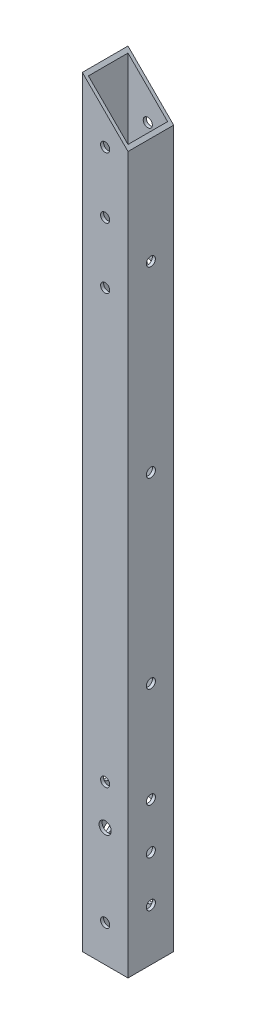
ISO-10303-21;
HEADER;
FILE_DESCRIPTION(('STEP AP214'),'2;1');
FILE_NAME('part.step','',(''),(''),'','','');
FILE_SCHEMA(('AUTOMOTIVE_DESIGN { 1 0 10303 214 1 1 1 1 }'));
ENDSEC;
DATA;
#1=APPLICATION_CONTEXT('core data for automotive mechanical design processes');
#2=APPLICATION_PROTOCOL_DEFINITION('international standard','automotive_design',2000,#1);
#3=PRODUCT_CONTEXT('',#1,'mechanical');
#4=PRODUCT('Part','Part','',(#3));
#5=PRODUCT_RELATED_PRODUCT_CATEGORY('part','',(#4));
#6=PRODUCT_DEFINITION_FORMATION('','',#4);
#7=PRODUCT_DEFINITION_CONTEXT('part definition',#1,'design');
#8=PRODUCT_DEFINITION('design','',#6,#7);
#9=PRODUCT_DEFINITION_SHAPE('','',#8);
#10=(LENGTH_UNIT() NAMED_UNIT(*) SI_UNIT(.MILLI.,.METRE.));
#11=(NAMED_UNIT(*) PLANE_ANGLE_UNIT() SI_UNIT($,.RADIAN.));
#12=(NAMED_UNIT(*) SI_UNIT($,.STERADIAN.) SOLID_ANGLE_UNIT());
#13=UNCERTAINTY_MEASURE_WITH_UNIT(LENGTH_MEASURE(1.E-05),#10,'distance_accuracy_value','');
#14=(GEOMETRIC_REPRESENTATION_CONTEXT(3) GLOBAL_UNCERTAINTY_ASSIGNED_CONTEXT((#13)) GLOBAL_UNIT_ASSIGNED_CONTEXT((#10,
#11,#12)) REPRESENTATION_CONTEXT('',''));
#15=CARTESIAN_POINT('',(0.,0.,0.));
#16=DIRECTION('',(0.,0.,1.));
#17=DIRECTION('',(1.,0.,0.));
#18=AXIS2_PLACEMENT_3D('',#15,#16,#17);
#19=CARTESIAN_POINT('',(0.,0.,0.));
#20=DIRECTION('',(0.,-1.,0.));
#21=DIRECTION('',(0.,0.,-1.));
#22=AXIS2_PLACEMENT_3D('',#19,#20,#21);
#23=PLANE('',#22);
#24=DIRECTION('',(0.,0.,-1.));
#25=VECTOR('',#24,1.);
#26=CARTESIAN_POINT('',(7.5,0.,7.5));
#27=LINE('',#26,#25);
#28=CARTESIAN_POINT('',(7.5,0.,7.5));
#29=VERTEX_POINT('',#28);
#30=CARTESIAN_POINT('',(7.5,0.,-7.5));
#31=VERTEX_POINT('',#30);
#32=EDGE_CURVE('E136',#29,#31,#27,.T.);
#33=ORIENTED_EDGE('',*,*,#32,.F.);
#34=DIRECTION('',(1.,0.,0.));
#35=VECTOR('',#34,1.);
#36=CARTESIAN_POINT('',(-7.5,0.,7.5));
#37=LINE('',#36,#35);
#38=CARTESIAN_POINT('',(-7.5,0.,7.5));
#39=VERTEX_POINT('',#38);
#40=EDGE_CURVE('E126',#39,#29,#37,.T.);
#41=ORIENTED_EDGE('',*,*,#40,.F.);
#42=DIRECTION('',(0.,0.,1.));
#43=VECTOR('',#42,1.);
#44=CARTESIAN_POINT('',(-7.5,0.,7.5));
#45=LINE('',#44,#43);
#46=CARTESIAN_POINT('',(-7.5,0.,-7.5));
#47=VERTEX_POINT('',#46);
#48=EDGE_CURVE('E130',#47,#39,#45,.T.);
#49=ORIENTED_EDGE('',*,*,#48,.F.);
#50=DIRECTION('',(-1.,0.,0.));
#51=VECTOR('',#50,1.);
#52=CARTESIAN_POINT('',(-7.5,0.,-7.5));
#53=LINE('',#52,#51);
#54=EDGE_CURVE('E117',#31,#47,#53,.T.);
#55=ORIENTED_EDGE('',*,*,#54,.F.);
#56=EDGE_LOOP('',(#33,#41,#49,#55));
#57=FACE_BOUND('',#56,.T.);
#58=DIRECTION('',(-1.,0.,0.));
#59=VECTOR('',#58,1.);
#60=CARTESIAN_POINT('',(-6.5,0.,-6.5));
#61=LINE('',#60,#59);
#62=CARTESIAN_POINT('',(6.5,0.,-6.5));
#63=VERTEX_POINT('',#62);
#64=CARTESIAN_POINT('',(-6.5,0.,-6.5));
#65=VERTEX_POINT('',#64);
#66=EDGE_CURVE('E272',#63,#65,#61,.T.);
#67=ORIENTED_EDGE('',*,*,#66,.T.);
#68=DIRECTION('',(0.,0.,1.));
#69=VECTOR('',#68,1.);
#70=CARTESIAN_POINT('',(-6.5,0.,6.5));
#71=LINE('',#70,#69);
#72=CARTESIAN_POINT('',(-6.5,0.,6.5));
#73=VERTEX_POINT('',#72);
#74=EDGE_CURVE('E263',#65,#73,#71,.T.);
#75=ORIENTED_EDGE('',*,*,#74,.T.);
#76=DIRECTION('',(1.,0.,0.));
#77=VECTOR('',#76,1.);
#78=CARTESIAN_POINT('',(-6.5,0.,6.5));
#79=LINE('',#78,#77);
#80=CARTESIAN_POINT('',(6.5,0.,6.5));
#81=VERTEX_POINT('',#80);
#82=EDGE_CURVE('E266',#73,#81,#79,.T.);
#83=ORIENTED_EDGE('',*,*,#82,.T.);
#84=DIRECTION('',(0.,0.,-1.));
#85=VECTOR('',#84,1.);
#86=CARTESIAN_POINT('',(6.5,0.,6.5));
#87=LINE('',#86,#85);
#88=EDGE_CURVE('E269',#81,#63,#87,.T.);
#89=ORIENTED_EDGE('',*,*,#88,.T.);
#90=EDGE_LOOP('',(#67,#75,#83,#89));
#91=FACE_BOUND('',#90,.T.);
#92=ADVANCED_FACE('F35',(#57,#91),#23,.T.);
#93=CARTESIAN_POINT('',(7.5,250.,7.5));
#94=DIRECTION('',(-1.,0.,0.));
#95=DIRECTION('',(0.,0.,1.));
#96=AXIS2_PLACEMENT_3D('',#93,#94,#95);
#97=PLANE('',#96);
#98=CARTESIAN_POINT('',(7.5,32.,0.));
#99=DIRECTION('',(1.,0.,0.));
#100=DIRECTION('',(0.,0.,-1.));
#101=AXIS2_PLACEMENT_3D('',#98,#99,#100);
#102=CIRCLE('',#101,1.5);
#103=CARTESIAN_POINT('',(7.5,32.,-1.5));
#104=VERTEX_POINT('',#103);
#105=EDGE_CURVE('E618',#104,#104,#102,.T.);
#106=ORIENTED_EDGE('',*,*,#105,.F.);
#107=EDGE_LOOP('',(#106));
#108=FACE_BOUND('',#107,.T.);
#109=CARTESIAN_POINT('',(7.5,47.,0.));
#110=DIRECTION('',(1.,0.,0.));
#111=DIRECTION('',(0.,0.,-1.));
#112=AXIS2_PLACEMENT_3D('',#109,#110,#111);
#113=CIRCLE('',#112,1.5);
#114=CARTESIAN_POINT('',(7.5,47.,-1.5));
#115=VERTEX_POINT('',#114);
#116=EDGE_CURVE('E626',#115,#115,#113,.T.);
#117=ORIENTED_EDGE('',*,*,#116,.F.);
#118=EDGE_LOOP('',(#117));
#119=FACE_BOUND('',#118,.T.);
#120=CARTESIAN_POINT('',(7.5,80.,0.));
#121=DIRECTION('',(1.,0.,0.));
#122=DIRECTION('',(0.,0.,-1.));
#123=AXIS2_PLACEMENT_3D('',#120,#121,#122);
#124=CIRCLE('',#123,1.5);
#125=CARTESIAN_POINT('',(7.5,80.,-1.5));
#126=VERTEX_POINT('',#125);
#127=EDGE_CURVE('E632',#126,#126,#124,.T.);
#128=ORIENTED_EDGE('',*,*,#127,.F.);
#129=EDGE_LOOP('',(#128));
#130=FACE_BOUND('',#129,.T.);
#131=CARTESIAN_POINT('',(7.5,140.,0.));
#132=DIRECTION('',(1.,0.,0.));
#133=DIRECTION('',(0.,0.,-1.));
#134=AXIS2_PLACEMENT_3D('',#131,#132,#133);
#135=CIRCLE('',#134,1.5);
#136=CARTESIAN_POINT('',(7.5,140.,-1.5));
#137=VERTEX_POINT('',#136);
#138=EDGE_CURVE('E638',#137,#137,#135,.T.);
#139=ORIENTED_EDGE('',*,*,#138,.F.);
#140=EDGE_LOOP('',(#139));
#141=FACE_BOUND('',#140,.T.);
#142=CARTESIAN_POINT('',(7.5,200.,0.));
#143=DIRECTION('',(1.,0.,0.));
#144=DIRECTION('',(0.,0.,-1.));
#145=AXIS2_PLACEMENT_3D('',#142,#143,#144);
#146=CIRCLE('',#145,1.5);
#147=CARTESIAN_POINT('',(7.5,200.,-1.5));
#148=VERTEX_POINT('',#147);
#149=EDGE_CURVE('E644',#148,#148,#146,.T.);
#150=ORIENTED_EDGE('',*,*,#149,.F.);
#151=EDGE_LOOP('',(#150));
#152=FACE_BOUND('',#151,.T.);
#153=CARTESIAN_POINT('',(7.5,17.,0.));
#154=DIRECTION('',(1.,0.,0.));
#155=DIRECTION('',(0.,0.,-1.));
#156=AXIS2_PLACEMENT_3D('',#153,#154,#155);
#157=CIRCLE('',#156,1.5);
#158=CARTESIAN_POINT('',(7.5,17.,-1.5));
#159=VERTEX_POINT('',#158);
#160=EDGE_CURVE('E203',#159,#159,#157,.T.);
#161=ORIENTED_EDGE('',*,*,#160,.F.);
#162=EDGE_LOOP('',(#161));
#163=FACE_BOUND('',#162,.T.);
#164=DIRECTION('',(0.,-1.,0.));
#165=VECTOR('',#164,1.);
#166=CARTESIAN_POINT('',(7.5,250.,-7.5));
#167=LINE('',#166,#165);
#168=CARTESIAN_POINT('',(7.5,235.,-7.5));
#169=VERTEX_POINT('',#168);
#170=EDGE_CURVE('E44',#169,#31,#167,.T.);
#171=ORIENTED_EDGE('',*,*,#170,.F.);
#172=DIRECTION('',(0.,0.,1.));
#173=VECTOR('',#172,1.);
#174=CARTESIAN_POINT('',(7.5,235.,-7.5));
#175=LINE('',#174,#173);
#176=CARTESIAN_POINT('',(7.5,235.,7.5));
#177=VERTEX_POINT('',#176);
#178=EDGE_CURVE('E108',#169,#177,#175,.T.);
#179=ORIENTED_EDGE('',*,*,#178,.T.);
#180=DIRECTION('',(0.,-1.,0.));
#181=VECTOR('',#180,1.);
#182=CARTESIAN_POINT('',(7.5,250.,7.5));
#183=LINE('',#182,#181);
#184=EDGE_CURVE('E125',#177,#29,#183,.T.);
#185=ORIENTED_EDGE('',*,*,#184,.T.);
#186=ORIENTED_EDGE('',*,*,#32,.T.);
#187=EDGE_LOOP('',(#171,#179,#185,#186));
#188=FACE_BOUND('',#187,.T.);
#189=ADVANCED_FACE('F37',(#108,#119,#130,#141,#152,#163,#188),#97,.F.);
#190=CARTESIAN_POINT('',(-7.5,250.,-7.5));
#191=DIRECTION('',(0.,0.,1.));
#192=DIRECTION('',(1.,0.,0.));
#193=AXIS2_PLACEMENT_3D('',#190,#191,#192);
#194=PLANE('',#193);
#195=CARTESIAN_POINT('',(0.,52.,-7.5));
#196=DIRECTION('',(0.,0.,1.));
#197=DIRECTION('',(1.,0.,0.));
#198=AXIS2_PLACEMENT_3D('',#195,#196,#197);
#199=CIRCLE('',#198,1.5);
#200=CARTESIAN_POINT('',(1.50000000000002,52.,-7.5));
#201=VERTEX_POINT('',#200);
#202=EDGE_CURVE('E224',#201,#201,#199,.T.);
#203=ORIENTED_EDGE('',*,*,#202,.T.);
#204=EDGE_LOOP('',(#203));
#205=FACE_BOUND('',#204,.T.);
#206=CARTESIAN_POINT('',(0.,39.,-7.5));
#207=DIRECTION('',(0.,0.,1.));
#208=DIRECTION('',(1.,0.,0.));
#209=AXIS2_PLACEMENT_3D('',#206,#207,#208);
#210=CIRCLE('',#209,2.);
#211=CARTESIAN_POINT('',(2.00000000000003,39.,-7.5));
#212=VERTEX_POINT('',#211);
#213=EDGE_CURVE('E218',#212,#212,#210,.T.);
#214=ORIENTED_EDGE('',*,*,#213,.T.);
#215=EDGE_LOOP('',(#214));
#216=FACE_BOUND('',#215,.T.);
#217=CARTESIAN_POINT('',(0.,192.5,-7.5));
#218=DIRECTION('',(0.,0.,1.));
#219=DIRECTION('',(1.,0.,0.));
#220=AXIS2_PLACEMENT_3D('',#217,#218,#219);
#221=CIRCLE('',#220,1.5);
#222=CARTESIAN_POINT('',(1.50000000000001,192.5,-7.5));
#223=VERTEX_POINT('',#222);
#224=EDGE_CURVE('E211',#223,#223,#221,.T.);
#225=ORIENTED_EDGE('',*,*,#224,.T.);
#226=EDGE_LOOP('',(#225));
#227=FACE_BOUND('',#226,.T.);
#228=CARTESIAN_POINT('',(0.,212.5,-7.5));
#229=DIRECTION('',(0.,0.,1.));
#230=DIRECTION('',(1.,0.,0.));
#231=AXIS2_PLACEMENT_3D('',#228,#229,#230);
#232=CIRCLE('',#231,1.5);
#233=CARTESIAN_POINT('',(1.50000000000001,212.5,-7.5));
#234=VERTEX_POINT('',#233);
#235=EDGE_CURVE('E151',#234,#234,#232,.T.);
#236=ORIENTED_EDGE('',*,*,#235,.T.);
#237=EDGE_LOOP('',(#236));
#238=FACE_BOUND('',#237,.T.);
#239=CARTESIAN_POINT('',(0.,12.,-7.5));
#240=DIRECTION('',(0.,0.,1.));
#241=DIRECTION('',(1.,0.,0.));
#242=AXIS2_PLACEMENT_3D('',#239,#240,#241);
#243=CIRCLE('',#242,1.5);
#244=CARTESIAN_POINT('',(1.50000000000003,12.,-7.5));
#245=VERTEX_POINT('',#244);
#246=EDGE_CURVE('E230',#245,#245,#243,.T.);
#247=ORIENTED_EDGE('',*,*,#246,.T.);
#248=EDGE_LOOP('',(#247));
#249=FACE_BOUND('',#248,.T.);
#250=CARTESIAN_POINT('',(0.,232.5,-7.5));
#251=DIRECTION('',(0.,0.,1.));
#252=DIRECTION('',(1.,0.,0.));
#253=AXIS2_PLACEMENT_3D('',#250,#251,#252);
#254=CIRCLE('',#253,1.5);
#255=CARTESIAN_POINT('',(1.5,232.5,-7.5));
#256=VERTEX_POINT('',#255);
#257=EDGE_CURVE('E147',#256,#256,#254,.T.);
#258=ORIENTED_EDGE('',*,*,#257,.T.);
#259=EDGE_LOOP('',(#258));
#260=FACE_BOUND('',#259,.T.);
#261=DIRECTION('',(0.,-1.,0.));
#262=VECTOR('',#261,1.);
#263=CARTESIAN_POINT('',(-7.5,250.,-7.5));
#264=LINE('',#263,#262);
#265=CARTESIAN_POINT('',(-7.5,250.,-7.5));
#266=VERTEX_POINT('',#265);
#267=EDGE_CURVE('E114',#266,#47,#264,.T.);
#268=ORIENTED_EDGE('',*,*,#267,.F.);
#269=DIRECTION('',(0.707106781186547,-0.707106781186548,0.));
#270=VECTOR('',#269,1.);
#271=CARTESIAN_POINT('',(7.5,235.,-7.5));
#272=LINE('',#271,#270);
#273=EDGE_CURVE('E101',#266,#169,#272,.T.);
#274=ORIENTED_EDGE('',*,*,#273,.T.);
#275=ORIENTED_EDGE('',*,*,#170,.T.);
#276=ORIENTED_EDGE('',*,*,#54,.T.);
#277=EDGE_LOOP('',(#268,#274,#275,#276));
#278=FACE_BOUND('',#277,.T.);
#279=ADVANCED_FACE('F115',(#205,#216,#227,#238,#249,#260,#278),#194,.F.);
#280=CARTESIAN_POINT('',(-7.5,250.,7.5));
#281=DIRECTION('',(1.,0.,0.));
#282=DIRECTION('',(0.,0.,-1.));
#283=AXIS2_PLACEMENT_3D('',#280,#281,#282);
#284=PLANE('',#283);
#285=CARTESIAN_POINT('',(-7.5,32.,0.));
#286=DIRECTION('',(1.,0.,0.));
#287=DIRECTION('',(0.,0.,-1.));
#288=AXIS2_PLACEMENT_3D('',#285,#286,#287);
#289=CIRCLE('',#288,1.5);
#290=CARTESIAN_POINT('',(-7.5,32.,-1.5));
#291=VERTEX_POINT('',#290);
#292=EDGE_CURVE('E178',#291,#291,#289,.T.);
#293=ORIENTED_EDGE('',*,*,#292,.T.);
#294=EDGE_LOOP('',(#293));
#295=FACE_BOUND('',#294,.T.);
#296=CARTESIAN_POINT('',(-7.5,47.,0.));
#297=DIRECTION('',(1.,0.,0.));
#298=DIRECTION('',(0.,0.,-1.));
#299=AXIS2_PLACEMENT_3D('',#296,#297,#298);
#300=CIRCLE('',#299,1.5);
#301=CARTESIAN_POINT('',(-7.5,47.,-1.5));
#302=VERTEX_POINT('',#301);
#303=EDGE_CURVE('E621',#302,#302,#300,.T.);
#304=ORIENTED_EDGE('',*,*,#303,.T.);
#305=EDGE_LOOP('',(#304));
#306=FACE_BOUND('',#305,.T.);
#307=CARTESIAN_POINT('',(-7.5,80.,0.));
#308=DIRECTION('',(1.,0.,0.));
#309=DIRECTION('',(0.,0.,-1.));
#310=AXIS2_PLACEMENT_3D('',#307,#308,#309);
#311=CIRCLE('',#310,1.5);
#312=CARTESIAN_POINT('',(-7.5,80.,-1.5));
#313=VERTEX_POINT('',#312);
#314=EDGE_CURVE('E629',#313,#313,#311,.T.);
#315=ORIENTED_EDGE('',*,*,#314,.T.);
#316=EDGE_LOOP('',(#315));
#317=FACE_BOUND('',#316,.T.);
#318=CARTESIAN_POINT('',(-7.5,140.,0.));
#319=DIRECTION('',(1.,0.,0.));
#320=DIRECTION('',(0.,0.,-1.));
#321=AXIS2_PLACEMENT_3D('',#318,#319,#320);
#322=CIRCLE('',#321,1.5);
#323=CARTESIAN_POINT('',(-7.5,140.,-1.5));
#324=VERTEX_POINT('',#323);
#325=EDGE_CURVE('E635',#324,#324,#322,.T.);
#326=ORIENTED_EDGE('',*,*,#325,.T.);
#327=EDGE_LOOP('',(#326));
#328=FACE_BOUND('',#327,.T.);
#329=CARTESIAN_POINT('',(-7.5,200.,0.));
#330=DIRECTION('',(1.,0.,0.));
#331=DIRECTION('',(0.,0.,-1.));
#332=AXIS2_PLACEMENT_3D('',#329,#330,#331);
#333=CIRCLE('',#332,1.5);
#334=CARTESIAN_POINT('',(-7.5,200.,-1.5));
#335=VERTEX_POINT('',#334);
#336=EDGE_CURVE('E641',#335,#335,#333,.T.);
#337=ORIENTED_EDGE('',*,*,#336,.T.);
#338=EDGE_LOOP('',(#337));
#339=FACE_BOUND('',#338,.T.);
#340=CARTESIAN_POINT('',(-7.5,17.,0.));
#341=DIRECTION('',(1.,0.,0.));
#342=DIRECTION('',(0.,0.,-1.));
#343=AXIS2_PLACEMENT_3D('',#340,#341,#342);
#344=CIRCLE('',#343,1.5);
#345=CARTESIAN_POINT('',(-7.5,17.,-1.5));
#346=VERTEX_POINT('',#345);
#347=EDGE_CURVE('E173',#346,#346,#344,.T.);
#348=ORIENTED_EDGE('',*,*,#347,.T.);
#349=EDGE_LOOP('',(#348));
#350=FACE_BOUND('',#349,.T.);
#351=ORIENTED_EDGE('',*,*,#48,.T.);
#352=DIRECTION('',(0.,-1.,0.));
#353=VECTOR('',#352,1.);
#354=CARTESIAN_POINT('',(-7.5,250.,7.5));
#355=LINE('',#354,#353);
#356=CARTESIAN_POINT('',(-7.5,250.,7.5));
#357=VERTEX_POINT('',#356);
#358=EDGE_CURVE('E120',#357,#39,#355,.T.);
#359=ORIENTED_EDGE('',*,*,#358,.F.);
#360=DIRECTION('',(0.,0.,1.));
#361=VECTOR('',#360,1.);
#362=CARTESIAN_POINT('',(-7.5,250.,7.5));
#363=LINE('',#362,#361);
#364=EDGE_CURVE('E105',#266,#357,#363,.T.);
#365=ORIENTED_EDGE('',*,*,#364,.F.);
#366=ORIENTED_EDGE('',*,*,#267,.T.);
#367=EDGE_LOOP('',(#351,#359,#365,#366));
#368=FACE_BOUND('',#367,.T.);
#369=ADVANCED_FACE('F123',(#295,#306,#317,#328,#339,#350,#368),#284,.F.);
#370=CARTESIAN_POINT('',(-7.5,250.,7.5));
#371=DIRECTION('',(0.,0.,-1.));
#372=DIRECTION('',(-1.,0.,0.));
#373=AXIS2_PLACEMENT_3D('',#370,#371,#372);
#374=PLANE('',#373);
#375=CARTESIAN_POINT('',(0.,52.,7.5));
#376=DIRECTION('',(0.,0.,1.));
#377=DIRECTION('',(1.,0.,0.));
#378=AXIS2_PLACEMENT_3D('',#375,#376,#377);
#379=CIRCLE('',#378,1.5);
#380=CARTESIAN_POINT('',(1.50000000000002,52.,7.5));
#381=VERTEX_POINT('',#380);
#382=EDGE_CURVE('E210',#381,#381,#379,.T.);
#383=ORIENTED_EDGE('',*,*,#382,.F.);
#384=EDGE_LOOP('',(#383));
#385=FACE_BOUND('',#384,.T.);
#386=CARTESIAN_POINT('',(0.,39.,7.5));
#387=DIRECTION('',(0.,0.,1.));
#388=DIRECTION('',(1.,0.,0.));
#389=AXIS2_PLACEMENT_3D('',#386,#387,#388);
#390=CIRCLE('',#389,2.);
#391=CARTESIAN_POINT('',(2.00000000000003,39.,7.5));
#392=VERTEX_POINT('',#391);
#393=EDGE_CURVE('E221',#392,#392,#390,.T.);
#394=ORIENTED_EDGE('',*,*,#393,.F.);
#395=EDGE_LOOP('',(#394));
#396=FACE_BOUND('',#395,.T.);
#397=CARTESIAN_POINT('',(0.,192.5,7.5));
#398=DIRECTION('',(0.,0.,1.));
#399=DIRECTION('',(1.,0.,0.));
#400=AXIS2_PLACEMENT_3D('',#397,#398,#399);
#401=CIRCLE('',#400,1.5);
#402=CARTESIAN_POINT('',(1.50000000000001,192.5,7.5));
#403=VERTEX_POINT('',#402);
#404=EDGE_CURVE('E215',#403,#403,#401,.T.);
#405=ORIENTED_EDGE('',*,*,#404,.F.);
#406=EDGE_LOOP('',(#405));
#407=FACE_BOUND('',#406,.T.);
#408=CARTESIAN_POINT('',(0.,212.5,7.5));
#409=DIRECTION('',(0.,0.,1.));
#410=DIRECTION('',(1.,0.,0.));
#411=AXIS2_PLACEMENT_3D('',#408,#409,#410);
#412=CIRCLE('',#411,1.5);
#413=CARTESIAN_POINT('',(1.50000000000001,212.5,7.5));
#414=VERTEX_POINT('',#413);
#415=EDGE_CURVE('E232',#414,#414,#412,.T.);
#416=ORIENTED_EDGE('',*,*,#415,.F.);
#417=EDGE_LOOP('',(#416));
#418=FACE_BOUND('',#417,.T.);
#419=CARTESIAN_POINT('',(0.,12.,7.5));
#420=DIRECTION('',(0.,0.,1.));
#421=DIRECTION('',(1.,0.,0.));
#422=AXIS2_PLACEMENT_3D('',#419,#420,#421);
#423=CIRCLE('',#422,1.5);
#424=CARTESIAN_POINT('',(1.50000000000003,12.,7.5));
#425=VERTEX_POINT('',#424);
#426=EDGE_CURVE('E214',#425,#425,#423,.T.);
#427=ORIENTED_EDGE('',*,*,#426,.F.);
#428=EDGE_LOOP('',(#427));
#429=FACE_BOUND('',#428,.T.);
#430=CARTESIAN_POINT('',(0.,232.5,7.5));
#431=DIRECTION('',(0.,0.,1.));
#432=DIRECTION('',(1.,0.,0.));
#433=AXIS2_PLACEMENT_3D('',#430,#431,#432);
#434=CIRCLE('',#433,1.5);
#435=CARTESIAN_POINT('',(1.5,232.5,7.5));
#436=VERTEX_POINT('',#435);
#437=EDGE_CURVE('E256',#436,#436,#434,.T.);
#438=ORIENTED_EDGE('',*,*,#437,.F.);
#439=EDGE_LOOP('',(#438));
#440=FACE_BOUND('',#439,.T.);
#441=ORIENTED_EDGE('',*,*,#184,.F.);
#442=DIRECTION('',(0.707106781186547,-0.707106781186548,0.));
#443=VECTOR('',#442,1.);
#444=CARTESIAN_POINT('',(7.5,235.,7.5));
#445=LINE('',#444,#443);
#446=EDGE_CURVE('E111',#357,#177,#445,.T.);
#447=ORIENTED_EDGE('',*,*,#446,.F.);
#448=ORIENTED_EDGE('',*,*,#358,.T.);
#449=ORIENTED_EDGE('',*,*,#40,.T.);
#450=EDGE_LOOP('',(#441,#447,#448,#449));
#451=FACE_BOUND('',#450,.T.);
#452=ADVANCED_FACE('F323',(#385,#396,#407,#418,#429,#440,#451),#374,.F.);
#453=CARTESIAN_POINT('',(-6.5,250.,6.5));
#454=DIRECTION('',(1.,0.,0.));
#455=DIRECTION('',(0.,0.,-1.));
#456=AXIS2_PLACEMENT_3D('',#453,#454,#455);
#457=PLANE('',#456);
#458=CARTESIAN_POINT('',(-6.5,32.,0.));
#459=DIRECTION('',(1.,0.,0.));
#460=DIRECTION('',(0.,0.,-1.));
#461=AXIS2_PLACEMENT_3D('',#458,#459,#460);
#462=CIRCLE('',#461,1.5);
#463=CARTESIAN_POINT('',(-6.5,32.,-1.5));
#464=VERTEX_POINT('',#463);
#465=EDGE_CURVE('E200',#464,#464,#462,.T.);
#466=ORIENTED_EDGE('',*,*,#465,.F.);
#467=EDGE_LOOP('',(#466));
#468=FACE_BOUND('',#467,.T.);
#469=CARTESIAN_POINT('',(-6.5,47.,0.));
#470=DIRECTION('',(1.,0.,0.));
#471=DIRECTION('',(0.,0.,-1.));
#472=AXIS2_PLACEMENT_3D('',#469,#470,#471);
#473=CIRCLE('',#472,1.5);
#474=CARTESIAN_POINT('',(-6.5,47.,-1.5));
#475=VERTEX_POINT('',#474);
#476=EDGE_CURVE('E188',#475,#475,#473,.T.);
#477=ORIENTED_EDGE('',*,*,#476,.F.);
#478=EDGE_LOOP('',(#477));
#479=FACE_BOUND('',#478,.T.);
#480=CARTESIAN_POINT('',(-6.5,80.,0.));
#481=DIRECTION('',(1.,0.,0.));
#482=DIRECTION('',(0.,0.,-1.));
#483=AXIS2_PLACEMENT_3D('',#480,#481,#482);
#484=CIRCLE('',#483,1.5);
#485=CARTESIAN_POINT('',(-6.5,80.,-1.5));
#486=VERTEX_POINT('',#485);
#487=EDGE_CURVE('E185',#486,#486,#484,.T.);
#488=ORIENTED_EDGE('',*,*,#487,.F.);
#489=EDGE_LOOP('',(#488));
#490=FACE_BOUND('',#489,.T.);
#491=CARTESIAN_POINT('',(-6.5,140.,0.));
#492=DIRECTION('',(1.,0.,0.));
#493=DIRECTION('',(0.,0.,-1.));
#494=AXIS2_PLACEMENT_3D('',#491,#492,#493);
#495=CIRCLE('',#494,1.5);
#496=CARTESIAN_POINT('',(-6.5,140.,-1.5));
#497=VERTEX_POINT('',#496);
#498=EDGE_CURVE('E182',#497,#497,#495,.T.);
#499=ORIENTED_EDGE('',*,*,#498,.F.);
#500=EDGE_LOOP('',(#499));
#501=FACE_BOUND('',#500,.T.);
#502=CARTESIAN_POINT('',(-6.5,200.,0.));
#503=DIRECTION('',(1.,0.,0.));
#504=DIRECTION('',(0.,0.,-1.));
#505=AXIS2_PLACEMENT_3D('',#502,#503,#504);
#506=CIRCLE('',#505,1.5);
#507=CARTESIAN_POINT('',(-6.5,200.,-1.5));
#508=VERTEX_POINT('',#507);
#509=EDGE_CURVE('E177',#508,#508,#506,.T.);
#510=ORIENTED_EDGE('',*,*,#509,.F.);
#511=EDGE_LOOP('',(#510));
#512=FACE_BOUND('',#511,.T.);
#513=CARTESIAN_POINT('',(-6.5,17.,0.));
#514=DIRECTION('',(1.,0.,0.));
#515=DIRECTION('',(0.,0.,-1.));
#516=AXIS2_PLACEMENT_3D('',#513,#514,#515);
#517=CIRCLE('',#516,1.5);
#518=CARTESIAN_POINT('',(-6.5,17.,-1.5));
#519=VERTEX_POINT('',#518);
#520=EDGE_CURVE('E172',#519,#519,#517,.T.);
#521=ORIENTED_EDGE('',*,*,#520,.F.);
#522=EDGE_LOOP('',(#521));
#523=FACE_BOUND('',#522,.T.);
#524=DIRECTION('',(0.,0.,-1.));
#525=VECTOR('',#524,1.);
#526=CARTESIAN_POINT('',(-6.5,249.,6.5));
#527=LINE('',#526,#525);
#528=CARTESIAN_POINT('',(-6.5,249.,6.5));
#529=VERTEX_POINT('',#528);
#530=CARTESIAN_POINT('',(-6.5,249.,-6.5));
#531=VERTEX_POINT('',#530);
#532=EDGE_CURVE('E51',#529,#531,#527,.T.);
#533=ORIENTED_EDGE('',*,*,#532,.F.);
#534=DIRECTION('',(0.,-1.,0.));
#535=VECTOR('',#534,1.);
#536=CARTESIAN_POINT('',(-6.5,250.,6.5));
#537=LINE('',#536,#535);
#538=EDGE_CURVE('E134',#529,#73,#537,.T.);
#539=ORIENTED_EDGE('',*,*,#538,.T.);
#540=ORIENTED_EDGE('',*,*,#74,.F.);
#541=DIRECTION('',(0.,-1.,0.));
#542=VECTOR('',#541,1.);
#543=CARTESIAN_POINT('',(-6.5,250.,-6.5));
#544=LINE('',#543,#542);
#545=EDGE_CURVE('E58',#531,#65,#544,.T.);
#546=ORIENTED_EDGE('',*,*,#545,.F.);
#547=EDGE_LOOP('',(#533,#539,#540,#546));
#548=FACE_BOUND('',#547,.T.);
#549=ADVANCED_FACE('F285',(#468,#479,#490,#501,#512,#523,#548),#457,.T.);
#550=CARTESIAN_POINT('',(-6.5,250.,6.5));
#551=DIRECTION('',(0.,0.,-1.));
#552=DIRECTION('',(-1.,0.,0.));
#553=AXIS2_PLACEMENT_3D('',#550,#551,#552);
#554=PLANE('',#553);
#555=CARTESIAN_POINT('',(0.,52.,6.5));
#556=DIRECTION('',(0.,0.,-1.));
#557=DIRECTION('',(-1.,0.,0.));
#558=AXIS2_PLACEMENT_3D('',#555,#556,#557);
#559=CIRCLE('',#558,1.5);
#560=CARTESIAN_POINT('',(-1.49999999999998,52.,6.5));
#561=VERTEX_POINT('',#560);
#562=EDGE_CURVE('E168',#561,#561,#559,.T.);
#563=ORIENTED_EDGE('',*,*,#562,.F.);
#564=EDGE_LOOP('',(#563));
#565=FACE_BOUND('',#564,.T.);
#566=CARTESIAN_POINT('',(0.,39.,6.5));
#567=DIRECTION('',(0.,0.,-1.));
#568=DIRECTION('',(-1.,0.,0.));
#569=AXIS2_PLACEMENT_3D('',#566,#567,#568);
#570=CIRCLE('',#569,2.);
#571=CARTESIAN_POINT('',(-1.99999999999998,39.,6.5));
#572=VERTEX_POINT('',#571);
#573=EDGE_CURVE('E164',#572,#572,#570,.T.);
#574=ORIENTED_EDGE('',*,*,#573,.F.);
#575=EDGE_LOOP('',(#574));
#576=FACE_BOUND('',#575,.T.);
#577=CARTESIAN_POINT('',(0.,192.5,6.5));
#578=DIRECTION('',(0.,0.,-1.));
#579=DIRECTION('',(-1.,0.,0.));
#580=AXIS2_PLACEMENT_3D('',#577,#578,#579);
#581=CIRCLE('',#580,1.5);
#582=CARTESIAN_POINT('',(-1.49999999999999,192.5,6.5));
#583=VERTEX_POINT('',#582);
#584=EDGE_CURVE('E160',#583,#583,#581,.T.);
#585=ORIENTED_EDGE('',*,*,#584,.F.);
#586=EDGE_LOOP('',(#585));
#587=FACE_BOUND('',#586,.T.);
#588=CARTESIAN_POINT('',(0.,212.5,6.5));
#589=DIRECTION('',(0.,0.,-1.));
#590=DIRECTION('',(-1.,0.,0.));
#591=AXIS2_PLACEMENT_3D('',#588,#589,#590);
#592=CIRCLE('',#591,1.5);
#593=CARTESIAN_POINT('',(-1.5,212.5,6.5));
#594=VERTEX_POINT('',#593);
#595=EDGE_CURVE('E156',#594,#594,#592,.T.);
#596=ORIENTED_EDGE('',*,*,#595,.F.);
#597=EDGE_LOOP('',(#596));
#598=FACE_BOUND('',#597,.T.);
#599=DIRECTION('',(-0.707106781186547,0.707106781186548,0.));
#600=VECTOR('',#599,1.);
#601=CARTESIAN_POINT('',(-7.,249.5,6.5));
#602=LINE('',#601,#600);
#603=CARTESIAN_POINT('',(6.5,236.,6.5));
#604=VERTEX_POINT('',#603);
#605=EDGE_CURVE('E245',#604,#529,#602,.T.);
#606=ORIENTED_EDGE('',*,*,#605,.F.);
#607=DIRECTION('',(0.,-1.,0.));
#608=VECTOR('',#607,1.);
#609=CARTESIAN_POINT('',(6.5,250.,6.5));
#610=LINE('',#609,#608);
#611=EDGE_CURVE('E277',#604,#81,#610,.T.);
#612=ORIENTED_EDGE('',*,*,#611,.T.);
#613=ORIENTED_EDGE('',*,*,#82,.F.);
#614=ORIENTED_EDGE('',*,*,#538,.F.);
#615=EDGE_LOOP('',(#606,#612,#613,#614));
#616=FACE_BOUND('',#615,.T.);
#617=CARTESIAN_POINT('',(0.,12.,6.5));
#618=DIRECTION('',(0.,0.,-1.));
#619=DIRECTION('',(-1.,0.,0.));
#620=AXIS2_PLACEMENT_3D('',#617,#618,#619);
#621=CIRCLE('',#620,1.5);
#622=CARTESIAN_POINT('',(-1.49999999999997,12.,6.5));
#623=VERTEX_POINT('',#622);
#624=EDGE_CURVE('E150',#623,#623,#621,.T.);
#625=ORIENTED_EDGE('',*,*,#624,.F.);
#626=EDGE_LOOP('',(#625));
#627=FACE_BOUND('',#626,.T.);
#628=CARTESIAN_POINT('',(0.,232.5,6.5));
#629=DIRECTION('',(0.,0.,-1.));
#630=DIRECTION('',(-1.,0.,0.));
#631=AXIS2_PLACEMENT_3D('',#628,#629,#630);
#632=CIRCLE('',#631,1.5);
#633=CARTESIAN_POINT('',(-1.5,232.5,6.5));
#634=VERTEX_POINT('',#633);
#635=EDGE_CURVE('E146',#634,#634,#632,.T.);
#636=ORIENTED_EDGE('',*,*,#635,.F.);
#637=EDGE_LOOP('',(#636));
#638=FACE_BOUND('',#637,.T.);
#639=ADVANCED_FACE('F286',(#565,#576,#587,#598,#616,#627,#638),#554,.T.);
#640=CARTESIAN_POINT('',(6.5,250.,6.5));
#641=DIRECTION('',(-1.,0.,0.));
#642=DIRECTION('',(0.,0.,1.));
#643=AXIS2_PLACEMENT_3D('',#640,#641,#642);
#644=PLANE('',#643);
#645=CARTESIAN_POINT('',(6.5,32.,0.));
#646=DIRECTION('',(-1.,0.,0.));
#647=DIRECTION('',(0.,0.,1.));
#648=AXIS2_PLACEMENT_3D('',#645,#646,#647);
#649=CIRCLE('',#648,1.5);
#650=CARTESIAN_POINT('',(6.5,32.,1.5));
#651=VERTEX_POINT('',#650);
#652=EDGE_CURVE('E39',#651,#651,#649,.T.);
#653=ORIENTED_EDGE('',*,*,#652,.F.);
#654=EDGE_LOOP('',(#653));
#655=FACE_BOUND('',#654,.T.);
#656=CARTESIAN_POINT('',(6.5,47.,0.));
#657=DIRECTION('',(-1.,0.,0.));
#658=DIRECTION('',(0.,0.,1.));
#659=AXIS2_PLACEMENT_3D('',#656,#657,#658);
#660=CIRCLE('',#659,1.5);
#661=CARTESIAN_POINT('',(6.5,47.,1.5));
#662=VERTEX_POINT('',#661);
#663=EDGE_CURVE('E186',#662,#662,#660,.T.);
#664=ORIENTED_EDGE('',*,*,#663,.F.);
#665=EDGE_LOOP('',(#664));
#666=FACE_BOUND('',#665,.T.);
#667=CARTESIAN_POINT('',(6.5,80.,0.));
#668=DIRECTION('',(-1.,0.,0.));
#669=DIRECTION('',(0.,0.,1.));
#670=AXIS2_PLACEMENT_3D('',#667,#668,#669);
#671=CIRCLE('',#670,1.5);
#672=CARTESIAN_POINT('',(6.5,80.,1.5));
#673=VERTEX_POINT('',#672);
#674=EDGE_CURVE('E183',#673,#673,#671,.T.);
#675=ORIENTED_EDGE('',*,*,#674,.F.);
#676=EDGE_LOOP('',(#675));
#677=FACE_BOUND('',#676,.T.);
#678=CARTESIAN_POINT('',(6.5,140.,0.));
#679=DIRECTION('',(-1.,0.,0.));
#680=DIRECTION('',(0.,0.,1.));
#681=AXIS2_PLACEMENT_3D('',#678,#679,#680);
#682=CIRCLE('',#681,1.5);
#683=CARTESIAN_POINT('',(6.5,140.,1.5));
#684=VERTEX_POINT('',#683);
#685=EDGE_CURVE('E179',#684,#684,#682,.T.);
#686=ORIENTED_EDGE('',*,*,#685,.F.);
#687=EDGE_LOOP('',(#686));
#688=FACE_BOUND('',#687,.T.);
#689=CARTESIAN_POINT('',(6.5,200.,0.));
#690=DIRECTION('',(-1.,0.,0.));
#691=DIRECTION('',(0.,0.,1.));
#692=AXIS2_PLACEMENT_3D('',#689,#690,#691);
#693=CIRCLE('',#692,1.5);
#694=CARTESIAN_POINT('',(6.5,200.,1.5));
#695=VERTEX_POINT('',#694);
#696=EDGE_CURVE('E174',#695,#695,#693,.T.);
#697=ORIENTED_EDGE('',*,*,#696,.F.);
#698=EDGE_LOOP('',(#697));
#699=FACE_BOUND('',#698,.T.);
#700=CARTESIAN_POINT('',(6.5,17.,0.));
#701=DIRECTION('',(-1.,0.,0.));
#702=DIRECTION('',(0.,0.,1.));
#703=AXIS2_PLACEMENT_3D('',#700,#701,#702);
#704=CIRCLE('',#703,1.5);
#705=CARTESIAN_POINT('',(6.5,17.,1.5));
#706=VERTEX_POINT('',#705);
#707=EDGE_CURVE('E169',#706,#706,#704,.T.);
#708=ORIENTED_EDGE('',*,*,#707,.F.);
#709=EDGE_LOOP('',(#708));
#710=FACE_BOUND('',#709,.T.);
#711=DIRECTION('',(0.,0.,1.));
#712=VECTOR('',#711,1.);
#713=CARTESIAN_POINT('',(6.5,236.,6.5));
#714=LINE('',#713,#712);
#715=CARTESIAN_POINT('',(6.5,236.,-6.5));
#716=VERTEX_POINT('',#715);
#717=EDGE_CURVE('E243',#716,#604,#714,.T.);
#718=ORIENTED_EDGE('',*,*,#717,.F.);
#719=DIRECTION('',(0.,-1.,0.));
#720=VECTOR('',#719,1.);
#721=CARTESIAN_POINT('',(6.5,250.,-6.5));
#722=LINE('',#721,#720);
#723=EDGE_CURVE('E276',#716,#63,#722,.T.);
#724=ORIENTED_EDGE('',*,*,#723,.T.);
#725=ORIENTED_EDGE('',*,*,#88,.F.);
#726=ORIENTED_EDGE('',*,*,#611,.F.);
#727=EDGE_LOOP('',(#718,#724,#725,#726));
#728=FACE_BOUND('',#727,.T.);
#729=ADVANCED_FACE('F294',(#655,#666,#677,#688,#699,#710,#728),#644,.T.);
#730=CARTESIAN_POINT('',(-6.5,250.,-6.5));
#731=DIRECTION('',(0.,0.,1.));
#732=DIRECTION('',(1.,0.,0.));
#733=AXIS2_PLACEMENT_3D('',#730,#731,#732);
#734=PLANE('',#733);
#735=CARTESIAN_POINT('',(0.,52.,-6.5));
#736=DIRECTION('',(0.,0.,1.));
#737=DIRECTION('',(1.,0.,0.));
#738=AXIS2_PLACEMENT_3D('',#735,#736,#737);
#739=CIRCLE('',#738,1.5);
#740=CARTESIAN_POINT('',(1.50000000000002,52.,-6.5));
#741=VERTEX_POINT('',#740);
#742=EDGE_CURVE('E165',#741,#741,#739,.T.);
#743=ORIENTED_EDGE('',*,*,#742,.F.);
#744=EDGE_LOOP('',(#743));
#745=FACE_BOUND('',#744,.T.);
#746=CARTESIAN_POINT('',(0.,39.,-6.5));
#747=DIRECTION('',(0.,0.,1.));
#748=DIRECTION('',(1.,0.,0.));
#749=AXIS2_PLACEMENT_3D('',#746,#747,#748);
#750=CIRCLE('',#749,2.);
#751=CARTESIAN_POINT('',(2.00000000000003,39.,-6.5));
#752=VERTEX_POINT('',#751);
#753=EDGE_CURVE('E161',#752,#752,#750,.T.);
#754=ORIENTED_EDGE('',*,*,#753,.F.);
#755=EDGE_LOOP('',(#754));
#756=FACE_BOUND('',#755,.T.);
#757=CARTESIAN_POINT('',(0.,192.5,-6.5));
#758=DIRECTION('',(0.,0.,1.));
#759=DIRECTION('',(1.,0.,0.));
#760=AXIS2_PLACEMENT_3D('',#757,#758,#759);
#761=CIRCLE('',#760,1.5);
#762=CARTESIAN_POINT('',(1.50000000000001,192.5,-6.5));
#763=VERTEX_POINT('',#762);
#764=EDGE_CURVE('E157',#763,#763,#761,.T.);
#765=ORIENTED_EDGE('',*,*,#764,.F.);
#766=EDGE_LOOP('',(#765));
#767=FACE_BOUND('',#766,.T.);
#768=CARTESIAN_POINT('',(0.,212.5,-6.5));
#769=DIRECTION('',(0.,0.,1.));
#770=DIRECTION('',(1.,0.,0.));
#771=AXIS2_PLACEMENT_3D('',#768,#769,#770);
#772=CIRCLE('',#771,1.5);
#773=CARTESIAN_POINT('',(1.50000000000001,212.5,-6.5));
#774=VERTEX_POINT('',#773);
#775=EDGE_CURVE('E153',#774,#774,#772,.T.);
#776=ORIENTED_EDGE('',*,*,#775,.F.);
#777=EDGE_LOOP('',(#776));
#778=FACE_BOUND('',#777,.T.);
#779=DIRECTION('',(0.707106781186547,-0.707106781186548,0.));
#780=VECTOR('',#779,1.);
#781=CARTESIAN_POINT('',(-7.,249.5,-6.5));
#782=LINE('',#781,#780);
#783=EDGE_CURVE('E11',#531,#716,#782,.T.);
#784=ORIENTED_EDGE('',*,*,#783,.F.);
#785=ORIENTED_EDGE('',*,*,#545,.T.);
#786=ORIENTED_EDGE('',*,*,#66,.F.);
#787=ORIENTED_EDGE('',*,*,#723,.F.);
#788=EDGE_LOOP('',(#784,#785,#786,#787));
#789=FACE_BOUND('',#788,.T.);
#790=CARTESIAN_POINT('',(0.,12.,-6.5));
#791=DIRECTION('',(0.,0.,1.));
#792=DIRECTION('',(1.,0.,0.));
#793=AXIS2_PLACEMENT_3D('',#790,#791,#792);
#794=CIRCLE('',#793,1.5);
#795=CARTESIAN_POINT('',(1.50000000000003,12.,-6.5));
#796=VERTEX_POINT('',#795);
#797=EDGE_CURVE('E148',#796,#796,#794,.T.);
#798=ORIENTED_EDGE('',*,*,#797,.F.);
#799=EDGE_LOOP('',(#798));
#800=FACE_BOUND('',#799,.T.);
#801=CARTESIAN_POINT('',(0.,232.5,-6.5));
#802=DIRECTION('',(0.,0.,1.));
#803=DIRECTION('',(1.,0.,0.));
#804=AXIS2_PLACEMENT_3D('',#801,#802,#803);
#805=CIRCLE('',#804,1.5);
#806=CARTESIAN_POINT('',(1.5,232.5,-6.5));
#807=VERTEX_POINT('',#806);
#808=EDGE_CURVE('E143',#807,#807,#805,.T.);
#809=ORIENTED_EDGE('',*,*,#808,.F.);
#810=EDGE_LOOP('',(#809));
#811=FACE_BOUND('',#810,.T.);
#812=ADVANCED_FACE('F290',(#745,#756,#767,#778,#789,#800,#811),#734,.T.);
#813=CARTESIAN_POINT('',(0.,232.5,-7.5));
#814=DIRECTION('',(0.,0.,1.));
#815=DIRECTION('',(1.,0.,0.));
#816=AXIS2_PLACEMENT_3D('',#813,#814,#815);
#817=CYLINDRICAL_SURFACE('',#816,1.5);
#818=ORIENTED_EDGE('',*,*,#808,.T.);
#819=EDGE_LOOP('',(#818));
#820=FACE_BOUND('',#819,.T.);
#821=ORIENTED_EDGE('',*,*,#257,.F.);
#822=EDGE_LOOP('',(#821));
#823=FACE_BOUND('',#822,.T.);
#824=ADVANCED_FACE('F345',(#820,#823),#817,.F.);
#825=ORIENTED_EDGE('',*,*,#635,.T.);
#826=EDGE_LOOP('',(#825));
#827=FACE_BOUND('',#826,.T.);
#828=ORIENTED_EDGE('',*,*,#437,.T.);
#829=EDGE_LOOP('',(#828));
#830=FACE_BOUND('',#829,.T.);
#831=ADVANCED_FACE('F307',(#827,#830),#817,.F.);
#832=CARTESIAN_POINT('',(0.,12.,-7.5));
#833=DIRECTION('',(0.,0.,1.));
#834=DIRECTION('',(1.,0.,0.));
#835=AXIS2_PLACEMENT_3D('',#832,#833,#834);
#836=CYLINDRICAL_SURFACE('',#835,1.5);
#837=ORIENTED_EDGE('',*,*,#797,.T.);
#838=EDGE_LOOP('',(#837));
#839=FACE_BOUND('',#838,.T.);
#840=ORIENTED_EDGE('',*,*,#246,.F.);
#841=EDGE_LOOP('',(#840));
#842=FACE_BOUND('',#841,.T.);
#843=ADVANCED_FACE('F297',(#839,#842),#836,.F.);
#844=CARTESIAN_POINT('',(7.5,235.,-7.5));
#845=DIRECTION('',(-0.707106781186548,-0.707106781186547,0.));
#846=DIRECTION('',(0.707106781186547,-0.707106781186548,0.));
#847=AXIS2_PLACEMENT_3D('',#844,#845,#846);
#848=PLANE('',#847);
#849=ORIENTED_EDGE('',*,*,#532,.T.);
#850=ORIENTED_EDGE('',*,*,#783,.T.);
#851=ORIENTED_EDGE('',*,*,#717,.T.);
#852=ORIENTED_EDGE('',*,*,#605,.T.);
#853=EDGE_LOOP('',(#849,#850,#851,#852));
#854=FACE_BOUND('',#853,.T.);
#855=ORIENTED_EDGE('',*,*,#446,.T.);
#856=ORIENTED_EDGE('',*,*,#178,.F.);
#857=ORIENTED_EDGE('',*,*,#273,.F.);
#858=ORIENTED_EDGE('',*,*,#364,.T.);
#859=EDGE_LOOP('',(#855,#856,#857,#858));
#860=FACE_BOUND('',#859,.T.);
#861=ADVANCED_FACE('F103',(#854,#860),#848,.F.);
#862=CARTESIAN_POINT('',(0.,212.5,-7.5));
#863=DIRECTION('',(0.,0.,1.));
#864=DIRECTION('',(1.,0.,0.));
#865=AXIS2_PLACEMENT_3D('',#862,#863,#864);
#866=CYLINDRICAL_SURFACE('',#865,1.5);
#867=ORIENTED_EDGE('',*,*,#775,.T.);
#868=EDGE_LOOP('',(#867));
#869=FACE_BOUND('',#868,.T.);
#870=ORIENTED_EDGE('',*,*,#235,.F.);
#871=EDGE_LOOP('',(#870));
#872=FACE_BOUND('',#871,.T.);
#873=ADVANCED_FACE('F296',(#869,#872),#866,.F.);
#874=CARTESIAN_POINT('',(0.,192.5,-7.5));
#875=DIRECTION('',(0.,0.,1.));
#876=DIRECTION('',(1.,0.,0.));
#877=AXIS2_PLACEMENT_3D('',#874,#875,#876);
#878=CYLINDRICAL_SURFACE('',#877,1.5);
#879=ORIENTED_EDGE('',*,*,#764,.T.);
#880=EDGE_LOOP('',(#879));
#881=FACE_BOUND('',#880,.T.);
#882=ORIENTED_EDGE('',*,*,#224,.F.);
#883=EDGE_LOOP('',(#882));
#884=FACE_BOUND('',#883,.T.);
#885=ADVANCED_FACE('F303',(#881,#884),#878,.F.);
#886=CARTESIAN_POINT('',(0.,39.,-7.5));
#887=DIRECTION('',(0.,0.,1.));
#888=DIRECTION('',(1.,0.,0.));
#889=AXIS2_PLACEMENT_3D('',#886,#887,#888);
#890=CYLINDRICAL_SURFACE('',#889,2.);
#891=ORIENTED_EDGE('',*,*,#753,.T.);
#892=EDGE_LOOP('',(#891));
#893=FACE_BOUND('',#892,.T.);
#894=ORIENTED_EDGE('',*,*,#213,.F.);
#895=EDGE_LOOP('',(#894));
#896=FACE_BOUND('',#895,.T.);
#897=ADVANCED_FACE('F394',(#893,#896),#890,.F.);
#898=CARTESIAN_POINT('',(0.,52.,-7.5));
#899=DIRECTION('',(0.,0.,1.));
#900=DIRECTION('',(1.,0.,0.));
#901=AXIS2_PLACEMENT_3D('',#898,#899,#900);
#902=CYLINDRICAL_SURFACE('',#901,1.5);
#903=ORIENTED_EDGE('',*,*,#742,.T.);
#904=EDGE_LOOP('',(#903));
#905=FACE_BOUND('',#904,.T.);
#906=ORIENTED_EDGE('',*,*,#202,.F.);
#907=EDGE_LOOP('',(#906));
#908=FACE_BOUND('',#907,.T.);
#909=ADVANCED_FACE('F389',(#905,#908),#902,.F.);
#910=ORIENTED_EDGE('',*,*,#624,.T.);
#911=EDGE_LOOP('',(#910));
#912=FACE_BOUND('',#911,.T.);
#913=ORIENTED_EDGE('',*,*,#426,.T.);
#914=EDGE_LOOP('',(#913));
#915=FACE_BOUND('',#914,.T.);
#916=ADVANCED_FACE('F310',(#912,#915),#836,.F.);
#917=ORIENTED_EDGE('',*,*,#595,.T.);
#918=EDGE_LOOP('',(#917));
#919=FACE_BOUND('',#918,.T.);
#920=ORIENTED_EDGE('',*,*,#415,.T.);
#921=EDGE_LOOP('',(#920));
#922=FACE_BOUND('',#921,.T.);
#923=ADVANCED_FACE('F306',(#919,#922),#866,.F.);
#924=ORIENTED_EDGE('',*,*,#584,.T.);
#925=EDGE_LOOP('',(#924));
#926=FACE_BOUND('',#925,.T.);
#927=ORIENTED_EDGE('',*,*,#404,.T.);
#928=EDGE_LOOP('',(#927));
#929=FACE_BOUND('',#928,.T.);
#930=ADVANCED_FACE('F375',(#926,#929),#878,.F.);
#931=ORIENTED_EDGE('',*,*,#573,.T.);
#932=EDGE_LOOP('',(#931));
#933=FACE_BOUND('',#932,.T.);
#934=ORIENTED_EDGE('',*,*,#393,.T.);
#935=EDGE_LOOP('',(#934));
#936=FACE_BOUND('',#935,.T.);
#937=ADVANCED_FACE('F405',(#933,#936),#890,.F.);
#938=ORIENTED_EDGE('',*,*,#562,.T.);
#939=EDGE_LOOP('',(#938));
#940=FACE_BOUND('',#939,.T.);
#941=ORIENTED_EDGE('',*,*,#382,.T.);
#942=EDGE_LOOP('',(#941));
#943=FACE_BOUND('',#942,.T.);
#944=ADVANCED_FACE('F396',(#940,#943),#902,.F.);
#945=CARTESIAN_POINT('',(-7.5,17.,0.));
#946=DIRECTION('',(1.,0.,0.));
#947=DIRECTION('',(0.,0.,-1.));
#948=AXIS2_PLACEMENT_3D('',#945,#946,#947);
#949=CYLINDRICAL_SURFACE('',#948,1.5);
#950=ORIENTED_EDGE('',*,*,#707,.T.);
#951=EDGE_LOOP('',(#950));
#952=FACE_BOUND('',#951,.T.);
#953=ORIENTED_EDGE('',*,*,#160,.T.);
#954=EDGE_LOOP('',(#953));
#955=FACE_BOUND('',#954,.T.);
#956=ADVANCED_FACE('F408',(#952,#955),#949,.F.);
#957=ORIENTED_EDGE('',*,*,#520,.T.);
#958=EDGE_LOOP('',(#957));
#959=FACE_BOUND('',#958,.T.);
#960=ORIENTED_EDGE('',*,*,#347,.F.);
#961=EDGE_LOOP('',(#960));
#962=FACE_BOUND('',#961,.T.);
#963=ADVANCED_FACE('F414',(#959,#962),#949,.F.);
#964=CARTESIAN_POINT('',(-7.5,200.,0.));
#965=DIRECTION('',(1.,0.,0.));
#966=DIRECTION('',(0.,0.,-1.));
#967=AXIS2_PLACEMENT_3D('',#964,#965,#966);
#968=CYLINDRICAL_SURFACE('',#967,1.5);
#969=ORIENTED_EDGE('',*,*,#696,.T.);
#970=EDGE_LOOP('',(#969));
#971=FACE_BOUND('',#970,.T.);
#972=ORIENTED_EDGE('',*,*,#149,.T.);
#973=EDGE_LOOP('',(#972));
#974=FACE_BOUND('',#973,.T.);
#975=ADVANCED_FACE('F518',(#971,#974),#968,.F.);
#976=CARTESIAN_POINT('',(-7.5,140.,0.));
#977=DIRECTION('',(1.,0.,0.));
#978=DIRECTION('',(0.,0.,-1.));
#979=AXIS2_PLACEMENT_3D('',#976,#977,#978);
#980=CYLINDRICAL_SURFACE('',#979,1.5);
#981=ORIENTED_EDGE('',*,*,#685,.T.);
#982=EDGE_LOOP('',(#981));
#983=FACE_BOUND('',#982,.T.);
#984=ORIENTED_EDGE('',*,*,#138,.T.);
#985=EDGE_LOOP('',(#984));
#986=FACE_BOUND('',#985,.T.);
#987=ADVANCED_FACE('F527',(#983,#986),#980,.F.);
#988=CARTESIAN_POINT('',(-7.5,80.,0.));
#989=DIRECTION('',(1.,0.,0.));
#990=DIRECTION('',(0.,0.,-1.));
#991=AXIS2_PLACEMENT_3D('',#988,#989,#990);
#992=CYLINDRICAL_SURFACE('',#991,1.5);
#993=ORIENTED_EDGE('',*,*,#674,.T.);
#994=EDGE_LOOP('',(#993));
#995=FACE_BOUND('',#994,.T.);
#996=ORIENTED_EDGE('',*,*,#127,.T.);
#997=EDGE_LOOP('',(#996));
#998=FACE_BOUND('',#997,.T.);
#999=ADVANCED_FACE('F538',(#995,#998),#992,.F.);
#1000=CARTESIAN_POINT('',(-7.5,47.,0.));
#1001=DIRECTION('',(1.,0.,0.));
#1002=DIRECTION('',(0.,0.,-1.));
#1003=AXIS2_PLACEMENT_3D('',#1000,#1001,#1002);
#1004=CYLINDRICAL_SURFACE('',#1003,1.5);
#1005=ORIENTED_EDGE('',*,*,#663,.T.);
#1006=EDGE_LOOP('',(#1005));
#1007=FACE_BOUND('',#1006,.T.);
#1008=ORIENTED_EDGE('',*,*,#116,.T.);
#1009=EDGE_LOOP('',(#1008));
#1010=FACE_BOUND('',#1009,.T.);
#1011=ADVANCED_FACE('F549',(#1007,#1010),#1004,.F.);
#1012=CARTESIAN_POINT('',(-7.5,32.,0.));
#1013=DIRECTION('',(1.,0.,0.));
#1014=DIRECTION('',(0.,0.,-1.));
#1015=AXIS2_PLACEMENT_3D('',#1012,#1013,#1014);
#1016=CYLINDRICAL_SURFACE('',#1015,1.5);
#1017=ORIENTED_EDGE('',*,*,#652,.T.);
#1018=EDGE_LOOP('',(#1017));
#1019=FACE_BOUND('',#1018,.T.);
#1020=ORIENTED_EDGE('',*,*,#105,.T.);
#1021=EDGE_LOOP('',(#1020));
#1022=FACE_BOUND('',#1021,.T.);
#1023=ADVANCED_FACE('F560',(#1019,#1022),#1016,.F.);
#1024=ORIENTED_EDGE('',*,*,#509,.T.);
#1025=EDGE_LOOP('',(#1024));
#1026=FACE_BOUND('',#1025,.T.);
#1027=ORIENTED_EDGE('',*,*,#336,.F.);
#1028=EDGE_LOOP('',(#1027));
#1029=FACE_BOUND('',#1028,.T.);
#1030=ADVANCED_FACE('F530',(#1026,#1029),#968,.F.);
#1031=ORIENTED_EDGE('',*,*,#498,.T.);
#1032=EDGE_LOOP('',(#1031));
#1033=FACE_BOUND('',#1032,.T.);
#1034=ORIENTED_EDGE('',*,*,#325,.F.);
#1035=EDGE_LOOP('',(#1034));
#1036=FACE_BOUND('',#1035,.T.);
#1037=ADVANCED_FACE('F541',(#1033,#1036),#980,.F.);
#1038=ORIENTED_EDGE('',*,*,#487,.T.);
#1039=EDGE_LOOP('',(#1038));
#1040=FACE_BOUND('',#1039,.T.);
#1041=ORIENTED_EDGE('',*,*,#314,.F.);
#1042=EDGE_LOOP('',(#1041));
#1043=FACE_BOUND('',#1042,.T.);
#1044=ADVANCED_FACE('F552',(#1040,#1043),#992,.F.);
#1045=ORIENTED_EDGE('',*,*,#476,.T.);
#1046=EDGE_LOOP('',(#1045));
#1047=FACE_BOUND('',#1046,.T.);
#1048=ORIENTED_EDGE('',*,*,#303,.F.);
#1049=EDGE_LOOP('',(#1048));
#1050=FACE_BOUND('',#1049,.T.);
#1051=ADVANCED_FACE('F562',(#1047,#1050),#1004,.F.);
#1052=ORIENTED_EDGE('',*,*,#465,.T.);
#1053=EDGE_LOOP('',(#1052));
#1054=FACE_BOUND('',#1053,.T.);
#1055=ORIENTED_EDGE('',*,*,#292,.F.);
#1056=EDGE_LOOP('',(#1055));
#1057=FACE_BOUND('',#1056,.T.);
#1058=ADVANCED_FACE('F572',(#1054,#1057),#1016,.F.);
#1059=CLOSED_SHELL('',(#92,#189,#279,#369,#452,#549,#639,#729,#812,#824,#831,#843,#861,#873,
#885,#897,#909,#916,#923,#930,#937,#944,#956,#963,#975,#987,#999,#1011,#1023,#1030,#1037,#1044,
#1051,#1058));
#1060=MANIFOLD_SOLID_BREP('B2',#1059);
#1061=ADVANCED_BREP_SHAPE_REPRESENTATION('',(#18,#1060),#14);
#1062=SHAPE_DEFINITION_REPRESENTATION(#9,#1061);
ENDSEC;
END-ISO-10303-21;
